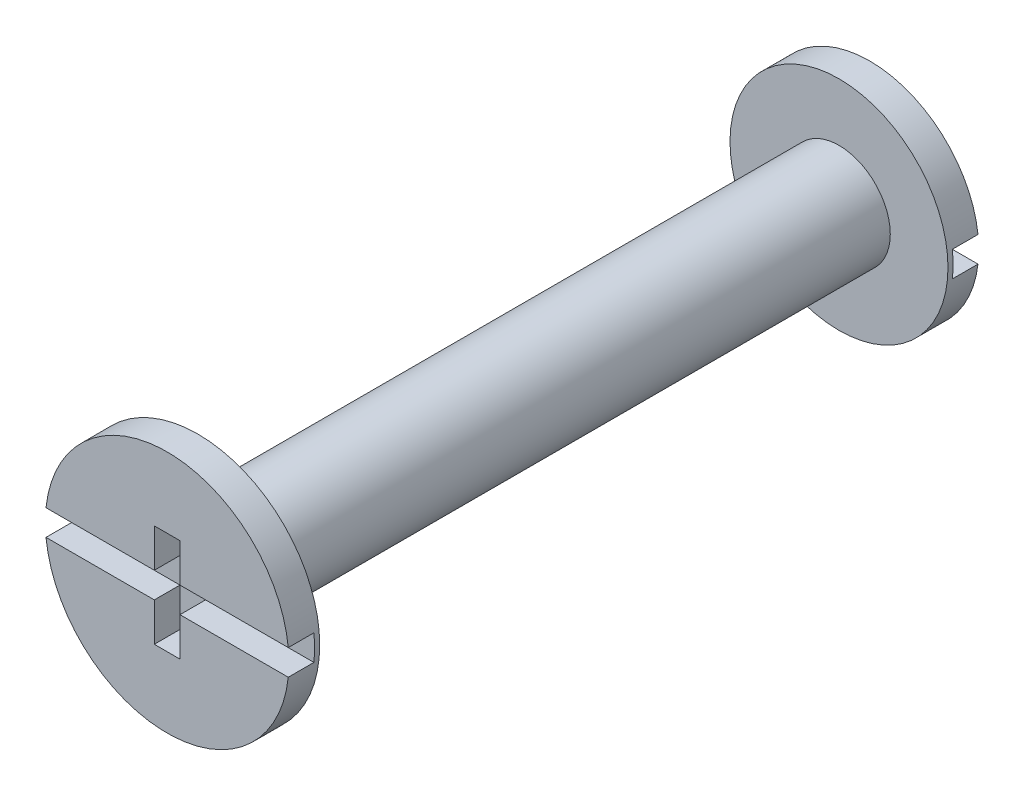
ISO-10303-21;
HEADER;
FILE_DESCRIPTION(('STEP AP214'),'2;1');
FILE_NAME('part.step','',(''),(''),'','','');
FILE_SCHEMA(('AUTOMOTIVE_DESIGN { 1 0 10303 214 1 1 1 1 }'));
ENDSEC;
DATA;
#1=APPLICATION_CONTEXT('core data for automotive mechanical design processes');
#2=APPLICATION_PROTOCOL_DEFINITION('international standard','automotive_design',2000,#1);
#3=PRODUCT_CONTEXT('',#1,'mechanical');
#4=PRODUCT('Part','Part','',(#3));
#5=PRODUCT_RELATED_PRODUCT_CATEGORY('part','',(#4));
#6=PRODUCT_DEFINITION_FORMATION('','',#4);
#7=PRODUCT_DEFINITION_CONTEXT('part definition',#1,'design');
#8=PRODUCT_DEFINITION('design','',#6,#7);
#9=PRODUCT_DEFINITION_SHAPE('','',#8);
#10=(LENGTH_UNIT() NAMED_UNIT(*) SI_UNIT(.MILLI.,.METRE.));
#11=(NAMED_UNIT(*) PLANE_ANGLE_UNIT() SI_UNIT($,.RADIAN.));
#12=(NAMED_UNIT(*) SI_UNIT($,.STERADIAN.) SOLID_ANGLE_UNIT());
#13=UNCERTAINTY_MEASURE_WITH_UNIT(LENGTH_MEASURE(1.E-05),#10,'distance_accuracy_value','');
#14=(GEOMETRIC_REPRESENTATION_CONTEXT(3) GLOBAL_UNCERTAINTY_ASSIGNED_CONTEXT((#13)) GLOBAL_UNIT_ASSIGNED_CONTEXT((#10,
#11,#12)) REPRESENTATION_CONTEXT('',''));
#15=CARTESIAN_POINT('',(0.,0.,0.));
#16=DIRECTION('',(0.,0.,1.));
#17=DIRECTION('',(1.,0.,0.));
#18=AXIS2_PLACEMENT_3D('',#15,#16,#17);
#19=CARTESIAN_POINT('',(0.,0.,0.));
#20=DIRECTION('',(0.,0.,1.));
#21=DIRECTION('',(1.,0.,0.));
#22=AXIS2_PLACEMENT_3D('',#19,#20,#21);
#23=PLANE('',#22);
#24=CARTESIAN_POINT('',(0.,0.,0.));
#25=DIRECTION('',(0.,0.,1.));
#26=DIRECTION('',(1.,0.,0.));
#27=AXIS2_PLACEMENT_3D('',#24,#25,#26);
#28=CIRCLE('',#27,4.25);
#29=CARTESIAN_POINT('',(4.22048575403353,0.5,0.));
#30=VERTEX_POINT('',#29);
#31=CARTESIAN_POINT('',(-4.22048575403353,0.5,0.));
#32=VERTEX_POINT('',#31);
#33=EDGE_CURVE('E166',#30,#32,#28,.T.);
#34=ORIENTED_EDGE('',*,*,#33,.F.);
#35=DIRECTION('',(-1.,0.,0.));
#36=VECTOR('',#35,1.);
#37=CARTESIAN_POINT('',(0.,0.5,0.));
#38=LINE('',#37,#36);
#39=EDGE_CURVE('E154',#30,#32,#38,.T.);
#40=ORIENTED_EDGE('',*,*,#39,.T.);
#41=EDGE_LOOP('',(#34,#40));
#42=FACE_BOUND('',#41,.T.);
#43=ADVANCED_FACE('F35',(#42),#23,.F.);
#44=CARTESIAN_POINT('',(0.,0.,27.4));
#45=DIRECTION('',(0.,0.,1.));
#46=DIRECTION('',(1.,0.,0.));
#47=AXIS2_PLACEMENT_3D('',#44,#45,#46);
#48=PLANE('',#47);
#49=DIRECTION('',(1.,0.,0.));
#50=VECTOR('',#49,1.);
#51=CARTESIAN_POINT('',(0.5,-0.5,27.4));
#52=LINE('',#51,#50);
#53=CARTESIAN_POINT('',(0.5,-0.5,27.4));
#54=VERTEX_POINT('',#53);
#55=CARTESIAN_POINT('',(4.7236109069228,-0.5,27.4));
#56=VERTEX_POINT('',#55);
#57=EDGE_CURVE('E198',#54,#56,#52,.T.);
#58=ORIENTED_EDGE('',*,*,#57,.F.);
#59=DIRECTION('',(0.,1.,0.));
#60=VECTOR('',#59,1.);
#61=CARTESIAN_POINT('',(0.5,-0.5,27.4));
#62=LINE('',#61,#60);
#63=CARTESIAN_POINT('',(0.5,-2.,27.4));
#64=VERTEX_POINT('',#63);
#65=EDGE_CURVE('E252',#64,#54,#62,.T.);
#66=ORIENTED_EDGE('',*,*,#65,.F.);
#67=DIRECTION('',(1.,0.,0.));
#68=VECTOR('',#67,1.);
#69=CARTESIAN_POINT('',(-0.5,-2.,27.4));
#70=LINE('',#69,#68);
#71=CARTESIAN_POINT('',(-0.5,-2.,27.4));
#72=VERTEX_POINT('',#71);
#73=EDGE_CURVE('E249',#72,#64,#70,.T.);
#74=ORIENTED_EDGE('',*,*,#73,.F.);
#75=DIRECTION('',(0.,-1.,0.));
#76=VECTOR('',#75,1.);
#77=CARTESIAN_POINT('',(-0.5,-0.5,27.4));
#78=LINE('',#77,#76);
#79=CARTESIAN_POINT('',(-0.5,-0.5,27.4));
#80=VERTEX_POINT('',#79);
#81=EDGE_CURVE('E246',#80,#72,#78,.T.);
#82=ORIENTED_EDGE('',*,*,#81,.F.);
#83=DIRECTION('',(1.,0.,0.));
#84=VECTOR('',#83,1.);
#85=CARTESIAN_POINT('',(-4.7236109069228,-0.5,27.4));
#86=LINE('',#85,#84);
#87=CARTESIAN_POINT('',(-4.7236109069228,-0.499999999999998,27.4));
#88=VERTEX_POINT('',#87);
#89=EDGE_CURVE('E243',#88,#80,#86,.T.);
#90=ORIENTED_EDGE('',*,*,#89,.F.);
#91=CARTESIAN_POINT('',(0.,0.,27.4));
#92=DIRECTION('',(0.,0.,1.));
#93=DIRECTION('',(1.,0.,0.));
#94=AXIS2_PLACEMENT_3D('',#91,#92,#93);
#95=CIRCLE('',#94,4.75);
#96=EDGE_CURVE('E285',#88,#56,#95,.T.);
#97=ORIENTED_EDGE('',*,*,#96,.T.);
#98=EDGE_LOOP('',(#58,#66,#74,#82,#90,#97));
#99=FACE_BOUND('',#98,.T.);
#100=ADVANCED_FACE('F294',(#99),#48,.T.);
#101=CARTESIAN_POINT('',(0.,0.,1.2));
#102=DIRECTION('',(0.,0.,1.));
#103=DIRECTION('',(1.,0.,0.));
#104=AXIS2_PLACEMENT_3D('',#101,#102,#103);
#105=PLANE('',#104);
#106=CARTESIAN_POINT('',(0.,0.,1.2));
#107=DIRECTION('',(0.,0.,1.));
#108=DIRECTION('',(1.,0.,0.));
#109=AXIS2_PLACEMENT_3D('',#106,#107,#108);
#110=CIRCLE('',#109,4.25);
#111=CARTESIAN_POINT('',(4.25,0.,1.2));
#112=VERTEX_POINT('',#111);
#113=EDGE_CURVE('E155',#112,#112,#110,.T.);
#114=ORIENTED_EDGE('',*,*,#113,.T.);
#115=EDGE_LOOP('',(#114));
#116=FACE_BOUND('',#115,.T.);
#117=CARTESIAN_POINT('',(0.,0.,1.2));
#118=DIRECTION('',(0.,0.,1.));
#119=DIRECTION('',(1.,0.,0.));
#120=AXIS2_PLACEMENT_3D('',#117,#118,#119);
#121=CIRCLE('',#120,2.);
#122=CARTESIAN_POINT('',(2.,0.,1.2));
#123=VERTEX_POINT('',#122);
#124=EDGE_CURVE('E171',#123,#123,#121,.T.);
#125=ORIENTED_EDGE('',*,*,#124,.F.);
#126=EDGE_LOOP('',(#125));
#127=FACE_BOUND('',#126,.T.);
#128=ADVANCED_FACE('F292',(#116,#127),#105,.T.);
#129=CARTESIAN_POINT('',(0.,0.,1.2));
#130=DIRECTION('',(0.,0.,-1.));
#131=DIRECTION('',(-1.,0.,0.));
#132=AXIS2_PLACEMENT_3D('',#129,#130,#131);
#133=CYLINDRICAL_SURFACE('',#132,4.25);
#134=CARTESIAN_POINT('',(0.,0.,1.));
#135=DIRECTION('',(0.,0.,-1.));
#136=DIRECTION('',(-1.,0.,0.));
#137=AXIS2_PLACEMENT_3D('',#134,#135,#136);
#138=CIRCLE('',#137,4.25);
#139=CARTESIAN_POINT('',(4.22048575403353,0.5,1.));
#140=VERTEX_POINT('',#139);
#141=CARTESIAN_POINT('',(4.22048575403353,-0.5,1.));
#142=VERTEX_POINT('',#141);
#143=EDGE_CURVE('E11',#140,#142,#138,.T.);
#144=ORIENTED_EDGE('',*,*,#143,.F.);
#145=DIRECTION('',(0.,0.,-1.));
#146=VECTOR('',#145,1.);
#147=CARTESIAN_POINT('',(4.22048575403353,0.5,1.2));
#148=LINE('',#147,#146);
#149=EDGE_CURVE('E187',#140,#30,#148,.T.);
#150=ORIENTED_EDGE('',*,*,#149,.T.);
#151=ORIENTED_EDGE('',*,*,#33,.T.);
#152=DIRECTION('',(0.,0.,-1.));
#153=VECTOR('',#152,1.);
#154=CARTESIAN_POINT('',(-4.22048575403353,0.5,1.2));
#155=LINE('',#154,#153);
#156=CARTESIAN_POINT('',(-4.22048575403353,0.5,1.));
#157=VERTEX_POINT('',#156);
#158=EDGE_CURVE('E163',#32,#157,#155,.F.);
#159=ORIENTED_EDGE('',*,*,#158,.T.);
#160=CARTESIAN_POINT('',(-4.22048575403353,-0.5,1.));
#161=VERTEX_POINT('',#160);
#162=EDGE_CURVE('E39',#161,#157,#138,.T.);
#163=ORIENTED_EDGE('',*,*,#162,.F.);
#164=DIRECTION('',(0.,0.,-1.));
#165=VECTOR('',#164,1.);
#166=CARTESIAN_POINT('',(-4.22048575403353,-0.5,1.2));
#167=LINE('',#166,#165);
#168=CARTESIAN_POINT('',(-4.22048575403353,-0.5,0.));
#169=VERTEX_POINT('',#168);
#170=EDGE_CURVE('E149',#161,#169,#167,.T.);
#171=ORIENTED_EDGE('',*,*,#170,.T.);
#172=CARTESIAN_POINT('',(4.22048575403353,-0.5,0.));
#173=VERTEX_POINT('',#172);
#174=EDGE_CURVE('E161',#169,#173,#28,.T.);
#175=ORIENTED_EDGE('',*,*,#174,.T.);
#176=DIRECTION('',(0.,0.,-1.));
#177=VECTOR('',#176,1.);
#178=CARTESIAN_POINT('',(4.22048575403353,-0.5,1.2));
#179=LINE('',#178,#177);
#180=EDGE_CURVE('E50',#173,#142,#179,.F.);
#181=ORIENTED_EDGE('',*,*,#180,.T.);
#182=EDGE_LOOP('',(#144,#150,#151,#159,#163,#171,#175,#181));
#183=FACE_BOUND('',#182,.T.);
#184=ORIENTED_EDGE('',*,*,#113,.F.);
#185=EDGE_LOOP('',(#184));
#186=FACE_BOUND('',#185,.T.);
#187=ADVANCED_FACE('F37',(#183,#186),#133,.T.);
#188=ORIENTED_EDGE('',*,*,#174,.F.);
#189=DIRECTION('',(1.,0.,0.));
#190=VECTOR('',#189,1.);
#191=CARTESIAN_POINT('',(0.,-0.5,0.));
#192=LINE('',#191,#190);
#193=EDGE_CURVE('E146',#169,#173,#192,.T.);
#194=ORIENTED_EDGE('',*,*,#193,.T.);
#195=EDGE_LOOP('',(#188,#194));
#196=FACE_BOUND('',#195,.T.);
#197=ADVANCED_FACE('F165',(#196),#23,.F.);
#198=CARTESIAN_POINT('',(0.,0.,26.2));
#199=DIRECTION('',(0.,0.,-1.));
#200=DIRECTION('',(-1.,0.,0.));
#201=AXIS2_PLACEMENT_3D('',#198,#199,#200);
#202=CYLINDRICAL_SURFACE('',#201,2.);
#203=CARTESIAN_POINT('',(0.,0.,26.2));
#204=DIRECTION('',(0.,0.,1.));
#205=DIRECTION('',(1.,0.,0.));
#206=AXIS2_PLACEMENT_3D('',#203,#204,#205);
#207=CIRCLE('',#206,2.);
#208=CARTESIAN_POINT('',(2.,0.,26.2));
#209=VERTEX_POINT('',#208);
#210=EDGE_CURVE('E167',#209,#209,#207,.T.);
#211=ORIENTED_EDGE('',*,*,#210,.F.);
#212=EDGE_LOOP('',(#211));
#213=FACE_BOUND('',#212,.T.);
#214=ORIENTED_EDGE('',*,*,#124,.T.);
#215=EDGE_LOOP('',(#214));
#216=FACE_BOUND('',#215,.T.);
#217=ADVANCED_FACE('F290',(#213,#216),#202,.T.);
#218=CARTESIAN_POINT('',(0.,0.,26.2));
#219=DIRECTION('',(0.,0.,1.));
#220=DIRECTION('',(1.,0.,0.));
#221=AXIS2_PLACEMENT_3D('',#218,#219,#220);
#222=PLANE('',#221);
#223=CARTESIAN_POINT('',(0.,0.,26.2));
#224=DIRECTION('',(0.,0.,1.));
#225=DIRECTION('',(1.,0.,0.));
#226=AXIS2_PLACEMENT_3D('',#223,#224,#225);
#227=CIRCLE('',#226,4.75);
#228=CARTESIAN_POINT('',(4.75,0.,26.2));
#229=VERTEX_POINT('',#228);
#230=EDGE_CURVE('E259',#229,#229,#227,.T.);
#231=ORIENTED_EDGE('',*,*,#230,.F.);
#232=EDGE_LOOP('',(#231));
#233=FACE_BOUND('',#232,.T.);
#234=ORIENTED_EDGE('',*,*,#210,.T.);
#235=EDGE_LOOP('',(#234));
#236=FACE_BOUND('',#235,.T.);
#237=ADVANCED_FACE('F313',(#233,#236),#222,.F.);
#238=CARTESIAN_POINT('',(0.,0.,27.4));
#239=DIRECTION('',(0.,0.,-1.));
#240=DIRECTION('',(-1.,0.,0.));
#241=AXIS2_PLACEMENT_3D('',#238,#239,#240);
#242=CYLINDRICAL_SURFACE('',#241,4.75);
#243=ORIENTED_EDGE('',*,*,#96,.F.);
#244=DIRECTION('',(0.,0.,1.));
#245=VECTOR('',#244,1.);
#246=CARTESIAN_POINT('',(-4.7236109069228,-0.499999999999998,26.4));
#247=LINE('',#246,#245);
#248=CARTESIAN_POINT('',(-4.7236109069228,-0.499999999999998,26.4));
#249=VERTEX_POINT('',#248);
#250=EDGE_CURVE('E268',#249,#88,#247,.T.);
#251=ORIENTED_EDGE('',*,*,#250,.F.);
#252=CARTESIAN_POINT('',(0.,0.,26.4));
#253=DIRECTION('',(0.,0.,1.));
#254=DIRECTION('',(1.,0.,0.));
#255=AXIS2_PLACEMENT_3D('',#252,#253,#254);
#256=CIRCLE('',#255,4.75);
#257=CARTESIAN_POINT('',(-4.7236109069228,0.5,26.4));
#258=VERTEX_POINT('',#257);
#259=EDGE_CURVE('E213',#258,#249,#256,.T.);
#260=ORIENTED_EDGE('',*,*,#259,.F.);
#261=DIRECTION('',(0.,0.,1.));
#262=VECTOR('',#261,1.);
#263=CARTESIAN_POINT('',(-4.7236109069228,0.5,26.4));
#264=LINE('',#263,#262);
#265=CARTESIAN_POINT('',(-4.7236109069228,0.5,27.4));
#266=VERTEX_POINT('',#265);
#267=EDGE_CURVE('E270',#258,#266,#264,.T.);
#268=ORIENTED_EDGE('',*,*,#267,.T.);
#269=CARTESIAN_POINT('',(4.7236109069228,0.5,27.4));
#270=VERTEX_POINT('',#269);
#271=EDGE_CURVE('E282',#270,#266,#95,.T.);
#272=ORIENTED_EDGE('',*,*,#271,.F.);
#273=DIRECTION('',(0.,0.,1.));
#274=VECTOR('',#273,1.);
#275=CARTESIAN_POINT('',(4.7236109069228,0.5,26.4));
#276=LINE('',#275,#274);
#277=CARTESIAN_POINT('',(4.7236109069228,0.5,26.4));
#278=VERTEX_POINT('',#277);
#279=EDGE_CURVE('E58',#278,#270,#276,.T.);
#280=ORIENTED_EDGE('',*,*,#279,.F.);
#281=CARTESIAN_POINT('',(0.,0.,26.4));
#282=DIRECTION('',(0.,0.,1.));
#283=DIRECTION('',(1.,0.,0.));
#284=AXIS2_PLACEMENT_3D('',#281,#282,#283);
#285=CIRCLE('',#284,4.75);
#286=CARTESIAN_POINT('',(4.7236109069228,-0.5,26.4));
#287=VERTEX_POINT('',#286);
#288=EDGE_CURVE('E194',#287,#278,#285,.T.);
#289=ORIENTED_EDGE('',*,*,#288,.F.);
#290=DIRECTION('',(0.,0.,1.));
#291=VECTOR('',#290,1.);
#292=CARTESIAN_POINT('',(4.7236109069228,-0.5,26.4));
#293=LINE('',#292,#291);
#294=EDGE_CURVE('E256',#287,#56,#293,.T.);
#295=ORIENTED_EDGE('',*,*,#294,.T.);
#296=EDGE_LOOP('',(#243,#251,#260,#268,#272,#280,#289,#295));
#297=FACE_BOUND('',#296,.T.);
#298=ORIENTED_EDGE('',*,*,#230,.T.);
#299=EDGE_LOOP('',(#298));
#300=FACE_BOUND('',#299,.T.);
#301=ADVANCED_FACE('F318',(#297,#300),#242,.T.);
#302=DIRECTION('',(-1.,0.,0.));
#303=VECTOR('',#302,1.);
#304=CARTESIAN_POINT('',(-4.7236109069228,0.5,27.4));
#305=LINE('',#304,#303);
#306=CARTESIAN_POINT('',(-0.5,0.5,27.4));
#307=VERTEX_POINT('',#306);
#308=EDGE_CURVE('E241',#307,#266,#305,.T.);
#309=ORIENTED_EDGE('',*,*,#308,.F.);
#310=DIRECTION('',(0.,-1.,0.));
#311=VECTOR('',#310,1.);
#312=CARTESIAN_POINT('',(-0.5,2.,27.4));
#313=LINE('',#312,#311);
#314=CARTESIAN_POINT('',(-0.5,2.,27.4));
#315=VERTEX_POINT('',#314);
#316=EDGE_CURVE('E238',#315,#307,#313,.T.);
#317=ORIENTED_EDGE('',*,*,#316,.F.);
#318=DIRECTION('',(-1.,0.,0.));
#319=VECTOR('',#318,1.);
#320=CARTESIAN_POINT('',(-0.5,2.,27.4));
#321=LINE('',#320,#319);
#322=CARTESIAN_POINT('',(0.5,2.,27.4));
#323=VERTEX_POINT('',#322);
#324=EDGE_CURVE('E235',#323,#315,#321,.T.);
#325=ORIENTED_EDGE('',*,*,#324,.F.);
#326=DIRECTION('',(0.,1.,0.));
#327=VECTOR('',#326,1.);
#328=CARTESIAN_POINT('',(0.5,2.,27.4));
#329=LINE('',#328,#327);
#330=CARTESIAN_POINT('',(0.5,0.5,27.4));
#331=VERTEX_POINT('',#330);
#332=EDGE_CURVE('E232',#331,#323,#329,.T.);
#333=ORIENTED_EDGE('',*,*,#332,.F.);
#334=DIRECTION('',(-1.,0.,0.));
#335=VECTOR('',#334,1.);
#336=CARTESIAN_POINT('',(0.5,0.5,27.4));
#337=LINE('',#336,#335);
#338=EDGE_CURVE('E190',#270,#331,#337,.T.);
#339=ORIENTED_EDGE('',*,*,#338,.F.);
#340=ORIENTED_EDGE('',*,*,#271,.T.);
#341=EDGE_LOOP('',(#309,#317,#325,#333,#339,#340));
#342=FACE_BOUND('',#341,.T.);
#343=ADVANCED_FACE('F303',(#342),#48,.T.);
#344=CARTESIAN_POINT('',(0.5,-0.5,26.4));
#345=DIRECTION('',(0.,-1.,0.));
#346=DIRECTION('',(0.,0.,-1.));
#347=AXIS2_PLACEMENT_3D('',#344,#345,#346);
#348=PLANE('',#347);
#349=ORIENTED_EDGE('',*,*,#57,.T.);
#350=ORIENTED_EDGE('',*,*,#294,.F.);
#351=DIRECTION('',(1.,0.,0.));
#352=VECTOR('',#351,1.);
#353=CARTESIAN_POINT('',(0.5,-0.5,26.4));
#354=LINE('',#353,#352);
#355=CARTESIAN_POINT('',(0.5,-0.5,26.4));
#356=VERTEX_POINT('',#355);
#357=EDGE_CURVE('E228',#356,#287,#354,.T.);
#358=ORIENTED_EDGE('',*,*,#357,.F.);
#359=DIRECTION('',(0.,0.,1.));
#360=VECTOR('',#359,1.);
#361=CARTESIAN_POINT('',(0.5,-0.5,26.4));
#362=LINE('',#361,#360);
#363=EDGE_CURVE('E260',#356,#54,#362,.T.);
#364=ORIENTED_EDGE('',*,*,#363,.T.);
#365=EDGE_LOOP('',(#349,#350,#358,#364));
#366=FACE_BOUND('',#365,.T.);
#367=ADVANCED_FACE('F327',(#366),#348,.F.);
#368=CARTESIAN_POINT('',(0.5,-0.5,26.4));
#369=DIRECTION('',(1.,0.,0.));
#370=DIRECTION('',(0.,1.,0.));
#371=AXIS2_PLACEMENT_3D('',#368,#369,#370);
#372=PLANE('',#371);
#373=ORIENTED_EDGE('',*,*,#65,.T.);
#374=ORIENTED_EDGE('',*,*,#363,.F.);
#375=DIRECTION('',(0.,1.,0.));
#376=VECTOR('',#375,1.);
#377=CARTESIAN_POINT('',(0.5,-0.5,26.4));
#378=LINE('',#377,#376);
#379=CARTESIAN_POINT('',(0.5,-2.,26.4));
#380=VERTEX_POINT('',#379);
#381=EDGE_CURVE('E225',#380,#356,#378,.T.);
#382=ORIENTED_EDGE('',*,*,#381,.F.);
#383=DIRECTION('',(0.,0.,1.));
#384=VECTOR('',#383,1.);
#385=CARTESIAN_POINT('',(0.5,-2.,26.4));
#386=LINE('',#385,#384);
#387=EDGE_CURVE('E262',#380,#64,#386,.T.);
#388=ORIENTED_EDGE('',*,*,#387,.T.);
#389=EDGE_LOOP('',(#373,#374,#382,#388));
#390=FACE_BOUND('',#389,.T.);
#391=ADVANCED_FACE('F360',(#390),#372,.F.);
#392=CARTESIAN_POINT('',(-0.5,-2.,26.4));
#393=DIRECTION('',(0.,-1.,0.));
#394=DIRECTION('',(0.,0.,-1.));
#395=AXIS2_PLACEMENT_3D('',#392,#393,#394);
#396=PLANE('',#395);
#397=ORIENTED_EDGE('',*,*,#73,.T.);
#398=ORIENTED_EDGE('',*,*,#387,.F.);
#399=DIRECTION('',(1.,0.,0.));
#400=VECTOR('',#399,1.);
#401=CARTESIAN_POINT('',(-0.5,-2.,26.4));
#402=LINE('',#401,#400);
#403=CARTESIAN_POINT('',(-0.5,-2.,26.4));
#404=VERTEX_POINT('',#403);
#405=EDGE_CURVE('E222',#404,#380,#402,.T.);
#406=ORIENTED_EDGE('',*,*,#405,.F.);
#407=DIRECTION('',(0.,0.,1.));
#408=VECTOR('',#407,1.);
#409=CARTESIAN_POINT('',(-0.5,-2.,26.4));
#410=LINE('',#409,#408);
#411=EDGE_CURVE('E264',#404,#72,#410,.T.);
#412=ORIENTED_EDGE('',*,*,#411,.T.);
#413=EDGE_LOOP('',(#397,#398,#406,#412));
#414=FACE_BOUND('',#413,.T.);
#415=ADVANCED_FACE('F356',(#414),#396,.F.);
#416=CARTESIAN_POINT('',(-0.5,-0.5,26.4));
#417=DIRECTION('',(-1.,0.,0.));
#418=DIRECTION('',(0.,-1.,0.));
#419=AXIS2_PLACEMENT_3D('',#416,#417,#418);
#420=PLANE('',#419);
#421=ORIENTED_EDGE('',*,*,#81,.T.);
#422=ORIENTED_EDGE('',*,*,#411,.F.);
#423=DIRECTION('',(0.,-1.,0.));
#424=VECTOR('',#423,1.);
#425=CARTESIAN_POINT('',(-0.5,-0.5,26.4));
#426=LINE('',#425,#424);
#427=CARTESIAN_POINT('',(-0.5,-0.5,26.4));
#428=VERTEX_POINT('',#427);
#429=EDGE_CURVE('E219',#428,#404,#426,.T.);
#430=ORIENTED_EDGE('',*,*,#429,.F.);
#431=DIRECTION('',(0.,0.,1.));
#432=VECTOR('',#431,1.);
#433=CARTESIAN_POINT('',(-0.5,-0.5,26.4));
#434=LINE('',#433,#432);
#435=EDGE_CURVE('E266',#428,#80,#434,.T.);
#436=ORIENTED_EDGE('',*,*,#435,.T.);
#437=EDGE_LOOP('',(#421,#422,#430,#436));
#438=FACE_BOUND('',#437,.T.);
#439=ADVANCED_FACE('F352',(#438),#420,.F.);
#440=CARTESIAN_POINT('',(-4.7236109069228,-0.5,26.4));
#441=DIRECTION('',(0.,-1.,0.));
#442=DIRECTION('',(0.,0.,-1.));
#443=AXIS2_PLACEMENT_3D('',#440,#441,#442);
#444=PLANE('',#443);
#445=ORIENTED_EDGE('',*,*,#89,.T.);
#446=ORIENTED_EDGE('',*,*,#435,.F.);
#447=DIRECTION('',(1.,0.,0.));
#448=VECTOR('',#447,1.);
#449=CARTESIAN_POINT('',(-4.7236109069228,-0.5,26.4));
#450=LINE('',#449,#448);
#451=EDGE_CURVE('E216',#249,#428,#450,.T.);
#452=ORIENTED_EDGE('',*,*,#451,.F.);
#453=ORIENTED_EDGE('',*,*,#250,.T.);
#454=EDGE_LOOP('',(#445,#446,#452,#453));
#455=FACE_BOUND('',#454,.T.);
#456=ADVANCED_FACE('F348',(#455),#444,.F.);
#457=CARTESIAN_POINT('',(-4.7236109069228,0.5,26.4));
#458=DIRECTION('',(0.,1.,0.));
#459=DIRECTION('',(0.,0.,1.));
#460=AXIS2_PLACEMENT_3D('',#457,#458,#459);
#461=PLANE('',#460);
#462=ORIENTED_EDGE('',*,*,#308,.T.);
#463=ORIENTED_EDGE('',*,*,#267,.F.);
#464=DIRECTION('',(-1.,0.,0.));
#465=VECTOR('',#464,1.);
#466=CARTESIAN_POINT('',(-4.7236109069228,0.5,26.4));
#467=LINE('',#466,#465);
#468=CARTESIAN_POINT('',(-0.5,0.5,26.4));
#469=VERTEX_POINT('',#468);
#470=EDGE_CURVE('E210',#469,#258,#467,.T.);
#471=ORIENTED_EDGE('',*,*,#470,.F.);
#472=DIRECTION('',(0.,0.,1.));
#473=VECTOR('',#472,1.);
#474=CARTESIAN_POINT('',(-0.5,0.5,26.4));
#475=LINE('',#474,#473);
#476=EDGE_CURVE('E273',#469,#307,#475,.T.);
#477=ORIENTED_EDGE('',*,*,#476,.T.);
#478=EDGE_LOOP('',(#462,#463,#471,#477));
#479=FACE_BOUND('',#478,.T.);
#480=ADVANCED_FACE('F344',(#479),#461,.F.);
#481=CARTESIAN_POINT('',(-0.5,2.,26.4));
#482=DIRECTION('',(-1.,0.,0.));
#483=DIRECTION('',(0.,-1.,0.));
#484=AXIS2_PLACEMENT_3D('',#481,#482,#483);
#485=PLANE('',#484);
#486=ORIENTED_EDGE('',*,*,#316,.T.);
#487=ORIENTED_EDGE('',*,*,#476,.F.);
#488=DIRECTION('',(0.,-1.,0.));
#489=VECTOR('',#488,1.);
#490=CARTESIAN_POINT('',(-0.5,2.,26.4));
#491=LINE('',#490,#489);
#492=CARTESIAN_POINT('',(-0.5,2.,26.4));
#493=VERTEX_POINT('',#492);
#494=EDGE_CURVE('E207',#493,#469,#491,.T.);
#495=ORIENTED_EDGE('',*,*,#494,.F.);
#496=DIRECTION('',(0.,0.,1.));
#497=VECTOR('',#496,1.);
#498=CARTESIAN_POINT('',(-0.5,2.,26.4));
#499=LINE('',#498,#497);
#500=EDGE_CURVE('E275',#493,#315,#499,.T.);
#501=ORIENTED_EDGE('',*,*,#500,.T.);
#502=EDGE_LOOP('',(#486,#487,#495,#501));
#503=FACE_BOUND('',#502,.T.);
#504=ADVANCED_FACE('F340',(#503),#485,.F.);
#505=CARTESIAN_POINT('',(-0.5,2.,26.4));
#506=DIRECTION('',(0.,1.,0.));
#507=DIRECTION('',(0.,0.,1.));
#508=AXIS2_PLACEMENT_3D('',#505,#506,#507);
#509=PLANE('',#508);
#510=ORIENTED_EDGE('',*,*,#324,.T.);
#511=ORIENTED_EDGE('',*,*,#500,.F.);
#512=DIRECTION('',(-1.,0.,0.));
#513=VECTOR('',#512,1.);
#514=CARTESIAN_POINT('',(-0.5,2.,26.4));
#515=LINE('',#514,#513);
#516=CARTESIAN_POINT('',(0.5,2.,26.4));
#517=VERTEX_POINT('',#516);
#518=EDGE_CURVE('E204',#517,#493,#515,.T.);
#519=ORIENTED_EDGE('',*,*,#518,.F.);
#520=DIRECTION('',(0.,0.,1.));
#521=VECTOR('',#520,1.);
#522=CARTESIAN_POINT('',(0.5,2.,26.4));
#523=LINE('',#522,#521);
#524=EDGE_CURVE('E277',#517,#323,#523,.T.);
#525=ORIENTED_EDGE('',*,*,#524,.T.);
#526=EDGE_LOOP('',(#510,#511,#519,#525));
#527=FACE_BOUND('',#526,.T.);
#528=ADVANCED_FACE('F336',(#527),#509,.F.);
#529=CARTESIAN_POINT('',(0.5,2.,26.4));
#530=DIRECTION('',(1.,0.,0.));
#531=DIRECTION('',(0.,0.,-1.));
#532=AXIS2_PLACEMENT_3D('',#529,#530,#531);
#533=PLANE('',#532);
#534=ORIENTED_EDGE('',*,*,#332,.T.);
#535=ORIENTED_EDGE('',*,*,#524,.F.);
#536=DIRECTION('',(0.,1.,0.));
#537=VECTOR('',#536,1.);
#538=CARTESIAN_POINT('',(0.5,2.,26.4));
#539=LINE('',#538,#537);
#540=CARTESIAN_POINT('',(0.5,0.5,26.4));
#541=VERTEX_POINT('',#540);
#542=EDGE_CURVE('E201',#541,#517,#539,.T.);
#543=ORIENTED_EDGE('',*,*,#542,.F.);
#544=DIRECTION('',(0.,0.,1.));
#545=VECTOR('',#544,1.);
#546=CARTESIAN_POINT('',(0.5,0.5,26.4));
#547=LINE('',#546,#545);
#548=EDGE_CURVE('E279',#541,#331,#547,.T.);
#549=ORIENTED_EDGE('',*,*,#548,.T.);
#550=EDGE_LOOP('',(#534,#535,#543,#549));
#551=FACE_BOUND('',#550,.T.);
#552=ADVANCED_FACE('F333',(#551),#533,.F.);
#553=CARTESIAN_POINT('',(0.5,0.5,26.4));
#554=DIRECTION('',(0.,1.,0.));
#555=DIRECTION('',(0.,0.,1.));
#556=AXIS2_PLACEMENT_3D('',#553,#554,#555);
#557=PLANE('',#556);
#558=ORIENTED_EDGE('',*,*,#338,.T.);
#559=ORIENTED_EDGE('',*,*,#548,.F.);
#560=DIRECTION('',(-1.,0.,0.));
#561=VECTOR('',#560,1.);
#562=CARTESIAN_POINT('',(0.5,0.5,26.4));
#563=LINE('',#562,#561);
#564=EDGE_CURVE('E197',#278,#541,#563,.T.);
#565=ORIENTED_EDGE('',*,*,#564,.F.);
#566=ORIENTED_EDGE('',*,*,#279,.T.);
#567=EDGE_LOOP('',(#558,#559,#565,#566));
#568=FACE_BOUND('',#567,.T.);
#569=ADVANCED_FACE('F329',(#568),#557,.F.);
#570=CARTESIAN_POINT('',(0.,0.,26.4));
#571=DIRECTION('',(0.,0.,1.));
#572=DIRECTION('',(1.,0.,0.));
#573=AXIS2_PLACEMENT_3D('',#570,#571,#572);
#574=PLANE('',#573);
#575=ORIENTED_EDGE('',*,*,#288,.T.);
#576=ORIENTED_EDGE('',*,*,#564,.T.);
#577=ORIENTED_EDGE('',*,*,#542,.T.);
#578=ORIENTED_EDGE('',*,*,#518,.T.);
#579=ORIENTED_EDGE('',*,*,#494,.T.);
#580=ORIENTED_EDGE('',*,*,#470,.T.);
#581=ORIENTED_EDGE('',*,*,#259,.T.);
#582=ORIENTED_EDGE('',*,*,#451,.T.);
#583=ORIENTED_EDGE('',*,*,#429,.T.);
#584=ORIENTED_EDGE('',*,*,#405,.T.);
#585=ORIENTED_EDGE('',*,*,#381,.T.);
#586=ORIENTED_EDGE('',*,*,#357,.T.);
#587=EDGE_LOOP('',(#575,#576,#577,#578,#579,#580,#581,#582,#583,#584,#585,#586));
#588=FACE_BOUND('',#587,.T.);
#589=ADVANCED_FACE('F332',(#588),#574,.T.);
#590=CARTESIAN_POINT('',(0.,0.,1.));
#591=DIRECTION('',(0.,0.,-1.));
#592=DIRECTION('',(-1.,0.,0.));
#593=AXIS2_PLACEMENT_3D('',#590,#591,#592);
#594=PLANE('',#593);
#595=ORIENTED_EDGE('',*,*,#143,.T.);
#596=DIRECTION('',(-1.,0.,0.));
#597=VECTOR('',#596,1.);
#598=CARTESIAN_POINT('',(4.7236109069228,-0.5,1.));
#599=LINE('',#598,#597);
#600=EDGE_CURVE('E183',#142,#161,#599,.T.);
#601=ORIENTED_EDGE('',*,*,#600,.T.);
#602=ORIENTED_EDGE('',*,*,#162,.T.);
#603=DIRECTION('',(1.,0.,0.));
#604=VECTOR('',#603,1.);
#605=CARTESIAN_POINT('',(4.7236109069228,0.5,1.));
#606=LINE('',#605,#604);
#607=EDGE_CURVE('E182',#157,#140,#606,.T.);
#608=ORIENTED_EDGE('',*,*,#607,.T.);
#609=EDGE_LOOP('',(#595,#601,#602,#608));
#610=FACE_BOUND('',#609,.T.);
#611=ADVANCED_FACE('F181',(#610),#594,.T.);
#612=CARTESIAN_POINT('',(4.7236109069228,0.5,1.));
#613=DIRECTION('',(0.,1.,0.));
#614=DIRECTION('',(0.,0.,1.));
#615=AXIS2_PLACEMENT_3D('',#612,#613,#614);
#616=PLANE('',#615);
#617=ORIENTED_EDGE('',*,*,#607,.F.);
#618=ORIENTED_EDGE('',*,*,#158,.F.);
#619=ORIENTED_EDGE('',*,*,#39,.F.);
#620=ORIENTED_EDGE('',*,*,#149,.F.);
#621=EDGE_LOOP('',(#617,#618,#619,#620));
#622=FACE_BOUND('',#621,.T.);
#623=ADVANCED_FACE('F185',(#622),#616,.F.);
#624=CARTESIAN_POINT('',(4.7236109069228,-0.5,1.));
#625=DIRECTION('',(0.,-1.,0.));
#626=DIRECTION('',(0.,0.,-1.));
#627=AXIS2_PLACEMENT_3D('',#624,#625,#626);
#628=PLANE('',#627);
#629=ORIENTED_EDGE('',*,*,#600,.F.);
#630=ORIENTED_EDGE('',*,*,#180,.F.);
#631=ORIENTED_EDGE('',*,*,#193,.F.);
#632=ORIENTED_EDGE('',*,*,#170,.F.);
#633=EDGE_LOOP('',(#629,#630,#631,#632));
#634=FACE_BOUND('',#633,.T.);
#635=ADVANCED_FACE('F148',(#634),#628,.F.);
#636=CLOSED_SHELL('',(#43,#100,#128,#187,#197,#217,#237,#301,#343,#367,#391,#415,#439,#456,#480,
#504,#528,#552,#569,#589,#611,#623,#635));
#637=MANIFOLD_SOLID_BREP('B2',#636);
#638=ADVANCED_BREP_SHAPE_REPRESENTATION('',(#18,#637),#14);
#639=SHAPE_DEFINITION_REPRESENTATION(#9,#638);
ENDSEC;
END-ISO-10303-21;
